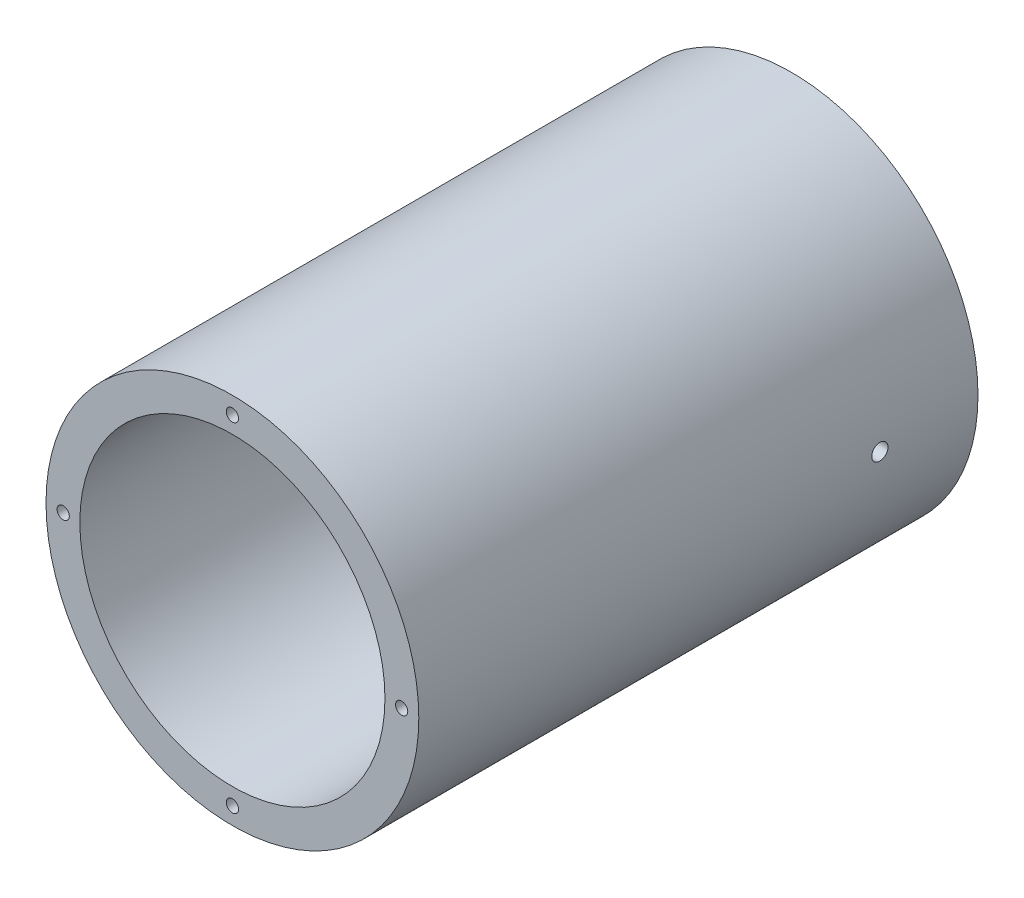
ISO-10303-21;
HEADER;
FILE_DESCRIPTION(('STEP AP214'),'2;1');
FILE_NAME('part.step','',(''),(''),'','','');
FILE_SCHEMA(('AUTOMOTIVE_DESIGN { 1 0 10303 214 1 1 1 1 }'));
ENDSEC;
DATA;
#1=APPLICATION_CONTEXT('core data for automotive mechanical design processes');
#2=APPLICATION_PROTOCOL_DEFINITION('international standard','automotive_design',2000,#1);
#3=PRODUCT_CONTEXT('',#1,'mechanical');
#4=PRODUCT('Part','Part','',(#3));
#5=PRODUCT_RELATED_PRODUCT_CATEGORY('part','',(#4));
#6=PRODUCT_DEFINITION_FORMATION('','',#4);
#7=PRODUCT_DEFINITION_CONTEXT('part definition',#1,'design');
#8=PRODUCT_DEFINITION('design','',#6,#7);
#9=PRODUCT_DEFINITION_SHAPE('','',#8);
#10=(LENGTH_UNIT() NAMED_UNIT(*) SI_UNIT(.MILLI.,.METRE.));
#11=(NAMED_UNIT(*) PLANE_ANGLE_UNIT() SI_UNIT($,.RADIAN.));
#12=(NAMED_UNIT(*) SI_UNIT($,.STERADIAN.) SOLID_ANGLE_UNIT());
#13=UNCERTAINTY_MEASURE_WITH_UNIT(LENGTH_MEASURE(1.E-05),#10,'distance_accuracy_value','');
#14=(GEOMETRIC_REPRESENTATION_CONTEXT(3) GLOBAL_UNCERTAINTY_ASSIGNED_CONTEXT((#13)) GLOBAL_UNIT_ASSIGNED_CONTEXT((#10,
#11,#12)) REPRESENTATION_CONTEXT('',''));
#15=CARTESIAN_POINT('',(0.,0.,0.));
#16=DIRECTION('',(0.,0.,1.));
#17=DIRECTION('',(1.,0.,0.));
#18=AXIS2_PLACEMENT_3D('',#15,#16,#17);
#19=CARTESIAN_POINT('',(0.,0.,57.));
#20=DIRECTION('',(0.,0.,1.));
#21=DIRECTION('',(1.,0.,0.));
#22=AXIS2_PLACEMENT_3D('',#19,#20,#21);
#23=PLANE('',#22);
#24=CARTESIAN_POINT('',(0.,34.5,57.));
#25=DIRECTION('',(0.,0.,1.));
#26=DIRECTION('',(1.,0.,0.));
#27=AXIS2_PLACEMENT_3D('',#24,#25,#26);
#28=CIRCLE('',#27,1.24999999999999);
#29=CARTESIAN_POINT('',(1.24999999999999,34.5,57.));
#30=VERTEX_POINT('',#29);
#31=EDGE_CURVE('E125',#30,#30,#28,.T.);
#32=ORIENTED_EDGE('',*,*,#31,.F.);
#33=EDGE_LOOP('',(#32));
#34=FACE_BOUND('',#33,.T.);
#35=CARTESIAN_POINT('',(34.500000000002,1.95687291924082E-12,57.));
#36=DIRECTION('',(0.,0.,1.));
#37=DIRECTION('',(1.,0.,0.));
#38=AXIS2_PLACEMENT_3D('',#35,#36,#37);
#39=CIRCLE('',#38,1.24999999999999);
#40=CARTESIAN_POINT('',(35.7500000000019,1.95687291924082E-12,57.));
#41=VERTEX_POINT('',#40);
#42=EDGE_CURVE('E131',#41,#41,#39,.T.);
#43=ORIENTED_EDGE('',*,*,#42,.F.);
#44=EDGE_LOOP('',(#43));
#45=FACE_BOUND('',#44,.T.);
#46=CARTESIAN_POINT('',(3.91374583848164E-12,-34.5,57.));
#47=DIRECTION('',(0.,0.,1.));
#48=DIRECTION('',(1.,0.,0.));
#49=AXIS2_PLACEMENT_3D('',#46,#47,#48);
#50=CIRCLE('',#49,1.24999999999999);
#51=CARTESIAN_POINT('',(1.2500000000039,-34.5,57.));
#52=VERTEX_POINT('',#51);
#53=EDGE_CURVE('E137',#52,#52,#50,.T.);
#54=ORIENTED_EDGE('',*,*,#53,.F.);
#55=EDGE_LOOP('',(#54));
#56=FACE_BOUND('',#55,.T.);
#57=CARTESIAN_POINT('',(-34.4999999999981,-1.95264788778376E-12,57.));
#58=DIRECTION('',(0.,0.,1.));
#59=DIRECTION('',(1.,0.,0.));
#60=AXIS2_PLACEMENT_3D('',#57,#58,#59);
#61=CIRCLE('',#60,1.24999999999999);
#62=CARTESIAN_POINT('',(-33.2499999999981,-1.95264788778376E-12,57.));
#63=VERTEX_POINT('',#62);
#64=EDGE_CURVE('E145',#63,#63,#61,.T.);
#65=ORIENTED_EDGE('',*,*,#64,.F.);
#66=EDGE_LOOP('',(#65));
#67=FACE_BOUND('',#66,.T.);
#68=CARTESIAN_POINT('',(0.,0.,57.));
#69=DIRECTION('',(0.,0.,1.));
#70=DIRECTION('',(1.,0.,0.));
#71=AXIS2_PLACEMENT_3D('',#68,#69,#70);
#72=CIRCLE('',#71,38.);
#73=CARTESIAN_POINT('',(38.,0.,57.));
#74=VERTEX_POINT('',#73);
#75=EDGE_CURVE('E11',#74,#74,#72,.T.);
#76=ORIENTED_EDGE('',*,*,#75,.T.);
#77=EDGE_LOOP('',(#76));
#78=FACE_BOUND('',#77,.T.);
#79=CARTESIAN_POINT('',(0.,0.,57.));
#80=DIRECTION('',(0.,0.,1.));
#81=DIRECTION('',(1.,0.,0.));
#82=AXIS2_PLACEMENT_3D('',#79,#80,#81);
#83=CIRCLE('',#82,31.1);
#84=CARTESIAN_POINT('',(31.1,0.,57.));
#85=VERTEX_POINT('',#84);
#86=EDGE_CURVE('E152',#85,#85,#83,.T.);
#87=ORIENTED_EDGE('',*,*,#86,.F.);
#88=EDGE_LOOP('',(#87));
#89=FACE_BOUND('',#88,.T.);
#90=ADVANCED_FACE('F45',(#34,#45,#56,#67,#78,#89),#23,.T.);
#91=CARTESIAN_POINT('',(0.,0.,-57.));
#92=DIRECTION('',(0.,0.,1.));
#93=DIRECTION('',(1.,0.,0.));
#94=AXIS2_PLACEMENT_3D('',#91,#92,#93);
#95=PLANE('',#94);
#96=CARTESIAN_POINT('',(-34.5,-1.14491749414469E-13,-57.));
#97=DIRECTION('',(0.,0.,-1.));
#98=DIRECTION('',(-1.,0.,0.));
#99=AXIS2_PLACEMENT_3D('',#96,#97,#98);
#100=CIRCLE('',#99,1.24999999999999);
#101=CARTESIAN_POINT('',(-35.75,-1.14491749414469E-13,-57.));
#102=VERTEX_POINT('',#101);
#103=EDGE_CURVE('E96',#102,#102,#100,.T.);
#104=ORIENTED_EDGE('',*,*,#103,.F.);
#105=EDGE_LOOP('',(#104));
#106=FACE_BOUND('',#105,.T.);
#107=CARTESIAN_POINT('',(1.14491749414469E-13,-34.5,-57.));
#108=DIRECTION('',(0.,0.,-1.));
#109=DIRECTION('',(-1.,0.,0.));
#110=AXIS2_PLACEMENT_3D('',#107,#108,#109);
#111=CIRCLE('',#110,1.24999999999999);
#112=CARTESIAN_POINT('',(-1.24999999999987,-34.5,-57.));
#113=VERTEX_POINT('',#112);
#114=EDGE_CURVE('E95',#113,#113,#111,.T.);
#115=ORIENTED_EDGE('',*,*,#114,.F.);
#116=EDGE_LOOP('',(#115));
#117=FACE_BOUND('',#116,.T.);
#118=CARTESIAN_POINT('',(34.5,1.17961196366423E-13,-57.));
#119=DIRECTION('',(0.,0.,-1.));
#120=DIRECTION('',(-1.,0.,0.));
#121=AXIS2_PLACEMENT_3D('',#118,#119,#120);
#122=CIRCLE('',#121,1.24999999999999);
#123=CARTESIAN_POINT('',(33.25,1.17961196366423E-13,-57.));
#124=VERTEX_POINT('',#123);
#125=EDGE_CURVE('E111',#124,#124,#122,.T.);
#126=ORIENTED_EDGE('',*,*,#125,.F.);
#127=EDGE_LOOP('',(#126));
#128=FACE_BOUND('',#127,.T.);
#129=CARTESIAN_POINT('',(-1.21430643318376E-13,34.5,-57.));
#130=DIRECTION('',(0.,0.,-1.));
#131=DIRECTION('',(-1.,0.,0.));
#132=AXIS2_PLACEMENT_3D('',#129,#130,#131);
#133=CIRCLE('',#132,1.24999999999999);
#134=CARTESIAN_POINT('',(-1.25000000000011,34.5,-57.));
#135=VERTEX_POINT('',#134);
#136=EDGE_CURVE('E119',#135,#135,#133,.T.);
#137=ORIENTED_EDGE('',*,*,#136,.F.);
#138=EDGE_LOOP('',(#137));
#139=FACE_BOUND('',#138,.T.);
#140=CARTESIAN_POINT('',(0.,0.,-57.));
#141=DIRECTION('',(0.,0.,1.));
#142=DIRECTION('',(1.,0.,0.));
#143=AXIS2_PLACEMENT_3D('',#140,#141,#142);
#144=CIRCLE('',#143,38.);
#145=CARTESIAN_POINT('',(38.,0.,-57.));
#146=VERTEX_POINT('',#145);
#147=EDGE_CURVE('E50',#146,#146,#144,.T.);
#148=ORIENTED_EDGE('',*,*,#147,.F.);
#149=EDGE_LOOP('',(#148));
#150=FACE_BOUND('',#149,.T.);
#151=CARTESIAN_POINT('',(0.,0.,-57.));
#152=DIRECTION('',(0.,0.,1.));
#153=DIRECTION('',(1.,0.,0.));
#154=AXIS2_PLACEMENT_3D('',#151,#152,#153);
#155=CIRCLE('',#154,31.1);
#156=CARTESIAN_POINT('',(31.1,0.,-57.));
#157=VERTEX_POINT('',#156);
#158=EDGE_CURVE('E151',#157,#157,#155,.T.);
#159=ORIENTED_EDGE('',*,*,#158,.T.);
#160=EDGE_LOOP('',(#159));
#161=FACE_BOUND('',#160,.T.);
#162=ADVANCED_FACE('F159',(#106,#117,#128,#139,#150,#161),#95,.F.);
#163=CARTESIAN_POINT('',(0.,0.,57.));
#164=DIRECTION('',(0.,0.,-1.));
#165=DIRECTION('',(-1.,0.,0.));
#166=AXIS2_PLACEMENT_3D('',#163,#164,#165);
#167=CYLINDRICAL_SURFACE('',#166,38.);
#168=CARTESIAN_POINT('',(38.,0.,-38.65));
#169=CARTESIAN_POINT('',(37.9999995194342,-0.0926343873516706,-38.6499959066816));
#170=CARTESIAN_POINT('',(37.9996576411054,-0.185334831172281,-38.642172778328));
#171=CARTESIAN_POINT('',(37.9983266871406,-0.368179488595521,-38.6110751267147));
#172=CARTESIAN_POINT('',(37.9973368449294,-0.458320542349799,-38.5877823015173));
#173=CARTESIAN_POINT('',(37.9948220211121,-0.633371208626469,-38.5264124783285));
#174=CARTESIAN_POINT('',(37.9932973080715,-0.718283421510545,-38.4883428989159));
#175=CARTESIAN_POINT('',(37.9898845637712,-0.88048880307308,-38.3985113360063));
#176=CARTESIAN_POINT('',(37.9879966194285,-0.957783787787719,-38.3467526270507));
#177=CARTESIAN_POINT('',(37.9840681874147,-1.1026455365318,-38.2309655505124));
#178=CARTESIAN_POINT('',(37.9820275950093,-1.17020552646643,-38.1669287107212));
#179=CARTESIAN_POINT('',(37.9780247628371,-1.29362194407478,-38.0284195977331));
#180=CARTESIAN_POINT('',(37.9760625262425,-1.34947789832146,-37.9539469026101));
#181=CARTESIAN_POINT('',(37.9724369874736,-1.44791760866178,-37.7966468191449));
#182=CARTESIAN_POINT('',(37.9707737984872,-1.49049634385826,-37.7138162858469));
#183=CARTESIAN_POINT('',(37.9679351157005,-1.56114066866396,-37.542173978369));
#184=CARTESIAN_POINT('',(37.9667596188709,-1.58920634842029,-37.453362241345));
#185=CARTESIAN_POINT('',(37.9650297812511,-1.63001071322264,-37.2723384638531));
#186=CARTESIAN_POINT('',(37.964475045539,-1.64275914332505,-37.1801286238415));
#187=CARTESIAN_POINT('',(37.9640480975593,-1.6525971836999,-36.9948761701993));
#188=CARTESIAN_POINT('',(37.9641758809286,-1.64968689407335,-36.9018335618961));
#189=CARTESIAN_POINT('',(37.9650991939384,-1.62829825058813,-36.7176228857958));
#190=CARTESIAN_POINT('',(37.9658942721118,-1.60983042235951,-36.6264535932951));
#191=CARTESIAN_POINT('',(37.9680618446454,-1.55786723848223,-36.4485104455133));
#192=CARTESIAN_POINT('',(37.9694343409976,-1.52437183098991,-36.3617366053971));
#193=CARTESIAN_POINT('',(37.9726025679745,-1.44329225223816,-36.1950136275335));
#194=CARTESIAN_POINT('',(37.974398443021,-1.39570327199294,-36.1150668313145));
#195=CARTESIAN_POINT('',(37.9782108525346,-1.28779094357622,-35.9642929642205));
#196=CARTESIAN_POINT('',(37.9802273881547,-1.22746752886342,-35.8934659410022));
#197=CARTESIAN_POINT('',(37.9842558279272,-1.09573924181622,-35.7628808622904));
#198=CARTESIAN_POINT('',(37.9862677268738,-1.02432525129551,-35.7031320042601));
#199=CARTESIAN_POINT('',(37.9900585103676,-0.87247507991611,-35.5964701540293));
#200=CARTESIAN_POINT('',(37.9918373948659,-0.792038897167133,-35.5495571645183));
#201=CARTESIAN_POINT('',(37.9949617056859,-0.624422345518426,-35.469899672236));
#202=CARTESIAN_POINT('',(37.9963071225581,-0.537241829643564,-35.4371554783394));
#203=CARTESIAN_POINT('',(37.9984127129505,-0.358613696426568,-35.3867710218167));
#204=CARTESIAN_POINT('',(37.9991728897805,-0.267166103219724,-35.3691306737718));
#205=CARTESIAN_POINT('',(38.000021895611,-0.0826795501663628,-35.3494659641771));
#206=CARTESIAN_POINT('',(38.0001112716218,0.01035805102182,-35.347428878783));
#207=CARTESIAN_POINT('',(37.9996100533562,0.195453818730521,-35.3589953327662));
#208=CARTESIAN_POINT('',(37.9990194607665,0.287511987680261,-35.3725988333421));
#209=CARTESIAN_POINT('',(37.9972251928853,0.468000116688769,-35.4150497753351));
#210=CARTESIAN_POINT('',(37.9960217507579,0.556431442797455,-35.4438914194162));
#211=CARTESIAN_POINT('',(37.9931373199913,0.727197679025692,-35.5159940633972));
#212=CARTESIAN_POINT('',(37.9914563292868,0.80953256277903,-35.5592551256544));
#213=CARTESIAN_POINT('',(37.9878046416091,0.965827212367055,-35.6590012354753));
#214=CARTESIAN_POINT('',(37.985833757794,1.03978152191713,-35.7154948256876));
#215=CARTESIAN_POINT('',(37.9818249288001,1.17716089568691,-35.8400898419622));
#216=CARTESIAN_POINT('',(37.979786983291,1.24058590802369,-35.908191325219));
#217=CARTESIAN_POINT('',(37.9758721891793,1.35514899571533,-36.0541236369915));
#218=CARTESIAN_POINT('',(37.9739954489289,1.4062788479287,-36.1319609243227));
#219=CARTESIAN_POINT('',(37.9706163826996,1.49474403258342,-36.295122597683));
#220=CARTESIAN_POINT('',(37.9691140553915,1.53207941399412,-36.3804469571324));
#221=CARTESIAN_POINT('',(37.9666539884121,1.5918814681568,-36.5561300753228));
#222=CARTESIAN_POINT('',(37.9656960556686,1.61435341276018,-36.6464870367291));
#223=CARTESIAN_POINT('',(37.9644322501256,1.64380795207979,-36.8296957044246));
#224=CARTESIAN_POINT('',(37.9641263748285,1.65079060612304,-36.922547401157));
#225=CARTESIAN_POINT('',(37.9642012430132,1.64906774813583,-37.1080278761415));
#226=CARTESIAN_POINT('',(37.9645814200104,1.64037517939304,-37.2006567751278));
#227=CARTESIAN_POINT('',(37.9659843452615,1.60757534012015,-37.3831389278321));
#228=CARTESIAN_POINT('',(37.9670070947612,1.58346803969957,-37.4729921761677));
#229=CARTESIAN_POINT('',(37.969579765854,1.52052551056582,-37.6473756383981));
#230=CARTESIAN_POINT('',(37.9711296936865,1.48169010753575,-37.7319057892769));
#231=CARTESIAN_POINT('',(37.9745819629553,1.39039641296064,-37.8932462093979));
#232=CARTESIAN_POINT('',(37.9764842928381,1.33793856800806,-37.9700567316028));
#233=CARTESIAN_POINT('',(37.9804286955674,1.22084420114374,-38.1138412374282));
#234=CARTESIAN_POINT('',(37.9824708677174,1.15619896651988,-38.1808081225429));
#235=CARTESIAN_POINT('',(37.9864642159771,1.01656476762932,-38.3029587254949));
#236=CARTESIAN_POINT('',(37.9884153695212,0.94157325634956,-38.3581395333238));
#237=CARTESIAN_POINT('',(37.9920078745747,0.783327797499344,-38.4551710373054));
#238=CARTESIAN_POINT('',(37.993648965049,0.700066977350689,-38.4970105218983));
#239=CARTESIAN_POINT('',(37.9964322609654,0.527758473785391,-38.5660671290563));
#240=CARTESIAN_POINT('',(37.9975750575366,0.438717791979388,-38.5933015865233));
#241=CARTESIAN_POINT('',(37.9989295116819,0.290933584448799,-38.6252030188477));
#242=CARTESIAN_POINT('',(37.9993291892242,0.23314808194173,-38.6344900810134));
#243=CARTESIAN_POINT('',(37.9998645849686,0.116917158880258,-38.646889861506));
#244=CARTESIAN_POINT('',(38.0000003033378,0.058471738743788,-38.650002583743));
#245=CARTESIAN_POINT('',(38.,0.,-38.65));
#246=B_SPLINE_CURVE_WITH_KNOTS('',3,(#168,#169,#170,#171,#172,#173,#174,#175,#176,#177,#178,
#179,#180,#181,#182,#183,#184,#185,#186,#187,#188,#189,#190,#191,#192,#193,#194,#195,#196,#197,
#198,#199,#200,#201,#202,#203,#204,#205,#206,#207,#208,#209,#210,#211,#212,#213,#214,#215,#216,
#217,#218,#219,#220,#221,#222,#223,#224,#225,#226,#227,#228,#229,#230,#231,#232,#233,#234,#235,
#236,#237,#238,#239,#240,#241,#242,#243,#244,#245),.UNSPECIFIED.,.T.,.F.,(4,2,2,2,2,2,2,2,2,2,2,
2,2,2,2,2,2,2,2,2,2,2,2,2,2,2,2,2,2,2,2,2,2,2,2,2,2,2,4),(0.,0.277689723908341,0.55570856448434,
0.833588007566176,1.11140103984864,1.38940646428512,1.66742313184257,1.94554480670585,
2.22366475400959,2.50160766351495,2.77954879622557,3.05730203557773,3.33505623315867,
3.61290531498349,3.89075584869049,4.16883604025131,4.44691629007441,4.72500260163852,
5.00308734049132,5.28094528805699,5.55880254630918,5.83655417009631,6.11430699504812,
6.39223962815774,6.67017363073479,6.94829300489981,7.22641139175251,7.50443108096261,
7.78244970530096,8.06023887022386,8.3380285738055,8.61582156531613,8.89360545092686,
9.1715886812928,9.44964046718964,9.7279253055539,10.0058791087496,10.1811597117191,
10.3564402036877),.UNSPECIFIED.);
#247=CARTESIAN_POINT('',(38.,0.,-38.65));
#248=VERTEX_POINT('',#247);
#249=EDGE_CURVE('E203',#248,#248,#246,.T.);
#250=ORIENTED_EDGE('',*,*,#249,.T.);
#251=EDGE_LOOP('',(#250));
#252=FACE_BOUND('',#251,.T.);
#253=CARTESIAN_POINT('',(-38.,0.,-35.35));
#254=CARTESIAN_POINT('',(-37.9999995194343,-0.0926343873516702,-35.3500040933184));
#255=CARTESIAN_POINT('',(-37.9996576411054,-0.18533483117228,-35.357827221672));
#256=CARTESIAN_POINT('',(-37.9983266871406,-0.368179488595519,-35.3889248732853));
#257=CARTESIAN_POINT('',(-37.9973368449294,-0.458320542349798,-35.4122176984827));
#258=CARTESIAN_POINT('',(-37.9948220211121,-0.633371208626468,-35.4735875216715));
#259=CARTESIAN_POINT('',(-37.9932973080715,-0.718283421510543,-35.5116571010841));
#260=CARTESIAN_POINT('',(-37.9898845637712,-0.880488803073077,-35.6014886639937));
#261=CARTESIAN_POINT('',(-37.9879966194285,-0.957783787787716,-35.6532473729493));
#262=CARTESIAN_POINT('',(-37.9840681874147,-1.10264553653179,-35.7690344494876));
#263=CARTESIAN_POINT('',(-37.9820275950093,-1.17020552646642,-35.8330712892788));
#264=CARTESIAN_POINT('',(-37.9780247628371,-1.29362194407478,-35.9715804022669));
#265=CARTESIAN_POINT('',(-37.9760625262425,-1.34947789832146,-36.0460530973899));
#266=CARTESIAN_POINT('',(-37.9724369874736,-1.44791760866178,-36.2033531808551));
#267=CARTESIAN_POINT('',(-37.9707737984872,-1.49049634385826,-36.2861837141531));
#268=CARTESIAN_POINT('',(-37.9679351157005,-1.56114066866396,-36.457826021631));
#269=CARTESIAN_POINT('',(-37.9667596188709,-1.58920634842029,-36.546637758655));
#270=CARTESIAN_POINT('',(-37.9650297812511,-1.63001071322264,-36.7276615361469));
#271=CARTESIAN_POINT('',(-37.964475045539,-1.64275914332505,-36.8198713761585));
#272=CARTESIAN_POINT('',(-37.9640480975593,-1.65259718369991,-37.0051238298007));
#273=CARTESIAN_POINT('',(-37.9641758809286,-1.64968689407335,-37.0981664381039));
#274=CARTESIAN_POINT('',(-37.9650991939384,-1.62829825058814,-37.2823771142042));
#275=CARTESIAN_POINT('',(-37.9658942721118,-1.60983042235951,-37.3735464067049));
#276=CARTESIAN_POINT('',(-37.9680618446454,-1.55786723848224,-37.5514895544868));
#277=CARTESIAN_POINT('',(-37.9694343409976,-1.52437183098992,-37.6382633946029));
#278=CARTESIAN_POINT('',(-37.9726025679745,-1.44329225223817,-37.8049863724665));
#279=CARTESIAN_POINT('',(-37.974398443021,-1.39570327199295,-37.8849331686855));
#280=CARTESIAN_POINT('',(-37.9782108525346,-1.28779094357623,-38.0357070357795));
#281=CARTESIAN_POINT('',(-37.9802273881547,-1.22746752886342,-38.1065340589978));
#282=CARTESIAN_POINT('',(-37.9842558279272,-1.09573924181623,-38.2371191377096));
#283=CARTESIAN_POINT('',(-37.9862677268738,-1.02432525129551,-38.2968679957399));
#284=CARTESIAN_POINT('',(-37.9900585103676,-0.872475079916113,-38.4035298459707));
#285=CARTESIAN_POINT('',(-37.9918373948659,-0.792038897167137,-38.4504428354817));
#286=CARTESIAN_POINT('',(-37.9949617056859,-0.62442234551843,-38.530100327764));
#287=CARTESIAN_POINT('',(-37.9963071225581,-0.537241829643569,-38.5628445216606));
#288=CARTESIAN_POINT('',(-37.9984127129505,-0.358613696426574,-38.6132289781833));
#289=CARTESIAN_POINT('',(-37.9991728897805,-0.267166103219732,-38.6308693262282));
#290=CARTESIAN_POINT('',(-38.000021895611,-0.0826795501663728,-38.6505340358229));
#291=CARTESIAN_POINT('',(-38.0001112716218,0.0103580510218101,-38.652571121217));
#292=CARTESIAN_POINT('',(-37.9996100533562,0.195453818730512,-38.6410046672338));
#293=CARTESIAN_POINT('',(-37.9990194607665,0.287511987680253,-38.6274011666579));
#294=CARTESIAN_POINT('',(-37.9972251928853,0.46800011668876,-38.584950224665));
#295=CARTESIAN_POINT('',(-37.9960217507579,0.556431442797445,-38.5561085805838));
#296=CARTESIAN_POINT('',(-37.9931373199913,0.727197679025683,-38.4840059366028));
#297=CARTESIAN_POINT('',(-37.9914563292868,0.809532562779022,-38.4407448743456));
#298=CARTESIAN_POINT('',(-37.9878046416091,0.96582721236705,-38.3409987645247));
#299=CARTESIAN_POINT('',(-37.985833757794,1.03978152191712,-38.2845051743125));
#300=CARTESIAN_POINT('',(-37.9818249288001,1.1771608956869,-38.1599101580378));
#301=CARTESIAN_POINT('',(-37.979786983291,1.24058590802369,-38.0918086747811));
#302=CARTESIAN_POINT('',(-37.9758721891793,1.35514899571533,-37.9458763630085));
#303=CARTESIAN_POINT('',(-37.9739954489289,1.40627884792869,-37.8680390756773));
#304=CARTESIAN_POINT('',(-37.9706163826996,1.49474403258341,-37.704877402317));
#305=CARTESIAN_POINT('',(-37.9691140553915,1.53207941399411,-37.6195530428676));
#306=CARTESIAN_POINT('',(-37.9666539884121,1.5918814681568,-37.4438699246772));
#307=CARTESIAN_POINT('',(-37.9656960556686,1.61435341276017,-37.3535129632709));
#308=CARTESIAN_POINT('',(-37.9644322501256,1.64380795207978,-37.1703042955755));
#309=CARTESIAN_POINT('',(-37.9641263748285,1.65079060612303,-37.077452598843));
#310=CARTESIAN_POINT('',(-37.9642012430132,1.64906774813583,-36.8919721238585));
#311=CARTESIAN_POINT('',(-37.9645814200104,1.64037517939304,-36.7993432248723));
#312=CARTESIAN_POINT('',(-37.9659843452615,1.60757534012015,-36.6168610721679));
#313=CARTESIAN_POINT('',(-37.9670070947612,1.58346803969956,-36.5270078238323));
#314=CARTESIAN_POINT('',(-37.969579765854,1.52052551056582,-36.3526243616019));
#315=CARTESIAN_POINT('',(-37.9711296936865,1.48169010753574,-36.2680942107232));
#316=CARTESIAN_POINT('',(-37.9745819629553,1.39039641296064,-36.1067537906021));
#317=CARTESIAN_POINT('',(-37.9764842928381,1.33793856800806,-36.0299432683972));
#318=CARTESIAN_POINT('',(-37.9804286955674,1.22084420114374,-35.8861587625718));
#319=CARTESIAN_POINT('',(-37.9824708677174,1.15619896651987,-35.8191918774571));
#320=CARTESIAN_POINT('',(-37.9864642159771,1.01656476762932,-35.6970412745051));
#321=CARTESIAN_POINT('',(-37.9884153695212,0.941573256349557,-35.6418604666762));
#322=CARTESIAN_POINT('',(-37.9920078745747,0.783327797499342,-35.5448289626946));
#323=CARTESIAN_POINT('',(-37.993648965049,0.700066977350689,-35.5029894781017));
#324=CARTESIAN_POINT('',(-37.9964322609654,0.527758473785391,-35.4339328709437));
#325=CARTESIAN_POINT('',(-37.9975750575366,0.438717791979388,-35.4066984134767));
#326=CARTESIAN_POINT('',(-37.9989295116819,0.290933584448799,-35.3747969811523));
#327=CARTESIAN_POINT('',(-37.9993291892242,0.233148081941729,-35.3655099189866));
#328=CARTESIAN_POINT('',(-37.9998645849686,0.116917158880257,-35.353110138494));
#329=CARTESIAN_POINT('',(-38.0000003033378,0.0584717387437875,-35.3499974162571));
#330=CARTESIAN_POINT('',(-38.,0.,-35.35));
#331=B_SPLINE_CURVE_WITH_KNOTS('',3,(#253,#254,#255,#256,#257,#258,#259,#260,#261,#262,#263,
#264,#265,#266,#267,#268,#269,#270,#271,#272,#273,#274,#275,#276,#277,#278,#279,#280,#281,#282,
#283,#284,#285,#286,#287,#288,#289,#290,#291,#292,#293,#294,#295,#296,#297,#298,#299,#300,#301,
#302,#303,#304,#305,#306,#307,#308,#309,#310,#311,#312,#313,#314,#315,#316,#317,#318,#319,#320,
#321,#322,#323,#324,#325,#326,#327,#328,#329,#330),.UNSPECIFIED.,.T.,.F.,(4,2,2,2,2,2,2,2,2,2,2,
2,2,2,2,2,2,2,2,2,2,2,2,2,2,2,2,2,2,2,2,2,2,2,2,2,2,2,4),(0.,0.27768972390834,0.555708564484338,
0.833588007566171,1.11140103984864,1.38940646428512,1.66742313184256,1.94554480670585,
2.22366475400959,2.50160766351495,2.77954879622557,3.05730203557773,3.33505623315867,
3.61290531498349,3.89075584869049,4.16883604025131,4.44691629007441,4.72500260163852,
5.00308734049131,5.28094528805699,5.55880254630918,5.83655417009631,6.11430699504812,
6.39223962815775,6.6701736307348,6.94829300489981,7.2264113917525,7.50443108096261,
7.78244970530096,8.06023887022386,8.3380285738055,8.61582156531614,8.89360545092686,
9.17158868129281,9.44964046718964,9.7279253055539,10.0058791087496,10.1811597117191,
10.3564402036877),.UNSPECIFIED.);
#332=CARTESIAN_POINT('',(-38.,0.,-35.35));
#333=VERTEX_POINT('',#332);
#334=EDGE_CURVE('E104',#333,#333,#331,.T.);
#335=ORIENTED_EDGE('',*,*,#334,.T.);
#336=EDGE_LOOP('',(#335));
#337=FACE_BOUND('',#336,.T.);
#338=ORIENTED_EDGE('',*,*,#75,.F.);
#339=EDGE_LOOP('',(#338));
#340=FACE_BOUND('',#339,.T.);
#341=ORIENTED_EDGE('',*,*,#147,.T.);
#342=EDGE_LOOP('',(#341));
#343=FACE_BOUND('',#342,.T.);
#344=ADVANCED_FACE('F47',(#252,#337,#340,#343),#167,.T.);
#345=CARTESIAN_POINT('',(0.,0.,57.));
#346=DIRECTION('',(0.,0.,-1.));
#347=DIRECTION('',(-1.,0.,0.));
#348=AXIS2_PLACEMENT_3D('',#345,#346,#347);
#349=CYLINDRICAL_SURFACE('',#348,31.1);
#350=CARTESIAN_POINT('',(31.1,0.,-38.65));
#351=CARTESIAN_POINT('',(31.0999994152321,-0.0926113241606523,-38.6499959154635));
#352=CARTESIAN_POINT('',(31.0995818961851,-0.185288139437185,-38.6421766664444));
#353=CARTESIAN_POINT('',(31.0979564687568,-0.368084609602513,-38.6110953224945));
#354=CARTESIAN_POINT('',(31.0967476316719,-0.458201129862964,-38.5878150818264));
#355=CARTESIAN_POINT('',(31.0936763729875,-0.633202609159297,-38.5264806466731));
#356=CARTESIAN_POINT('',(31.0918142871412,-0.718090229418302,-38.4884340406587));
#357=CARTESIAN_POINT('',(31.0876461833369,-0.880251284767709,-38.3986586845234));
#358=CARTESIAN_POINT('',(31.0853402695076,-0.957526499428521,-38.3469331426279));
#359=CARTESIAN_POINT('',(31.0805409788606,-1.10237850746259,-38.2312040472641));
#360=CARTESIAN_POINT('',(31.0780474202581,-1.16994570678198,-38.1671884920017));
#361=CARTESIAN_POINT('',(31.0731554426785,-1.29338186000706,-38.028720727143));
#362=CARTESIAN_POINT('',(31.0707570276108,-1.34925033362335,-37.9542680892633));
#363=CARTESIAN_POINT('',(31.0663244795823,-1.4477304993483,-37.796988094922));
#364=CARTESIAN_POINT('',(31.0642905566219,-1.49033455958087,-37.7141559533659));
#365=CARTESIAN_POINT('',(31.0608186100049,-1.56102760258269,-37.5425018979678));
#366=CARTESIAN_POINT('',(31.0593805814049,-1.58911670576286,-37.4536800338214));
#367=CARTESIAN_POINT('',(31.0572642570339,-1.62995676452337,-37.27265735383));
#368=CARTESIAN_POINT('',(31.0565852403766,-1.64272227483483,-37.1804598302031));
#369=CARTESIAN_POINT('',(31.0560613488158,-1.65259769452295,-36.9952282443879));
#370=CARTESIAN_POINT('',(31.0562164666889,-1.6497077394726,-36.9021941894508));
#371=CARTESIAN_POINT('',(31.0573426818807,-1.62836637537512,-36.7180294209294));
#372=CARTESIAN_POINT('',(31.0583129543335,-1.60993069718465,-36.6268968786799));
#373=CARTESIAN_POINT('',(31.0609588238351,-1.55804559095354,-36.4490218273883));
#374=CARTESIAN_POINT('',(31.0626344241439,-1.52459609351887,-36.3622793386392));
#375=CARTESIAN_POINT('',(31.0665030509316,-1.44361491569553,-36.1955960457115));
#376=CARTESIAN_POINT('',(31.0686963405178,-1.39607607146902,-36.1156587283555));
#377=CARTESIAN_POINT('',(31.0733528816609,-1.28827086521181,-35.9648930375069));
#378=CARTESIAN_POINT('',(31.0758161353761,-1.22800440142612,-35.8940647368465));
#379=CARTESIAN_POINT('',(31.0807386466621,-1.09636596673258,-35.7634360839669));
#380=CARTESIAN_POINT('',(31.0831978955434,-1.02498037535889,-35.7036494563119));
#381=CARTESIAN_POINT('',(31.0878322966669,-0.873177901355367,-35.596907053533));
#382=CARTESIAN_POINT('',(31.0900074488334,-0.792761016316848,-35.549951281831));
#383=CARTESIAN_POINT('',(31.0938286336405,-0.625170599617447,-35.4702047738429));
#384=CARTESIAN_POINT('',(31.0954746480488,-0.537996835266357,-35.4374145256382));
#385=CARTESIAN_POINT('',(31.0980517942589,-0.359370799027306,-35.3869388742306));
#386=CARTESIAN_POINT('',(31.098982932083,-0.267918563189554,-35.3692533437802));
#387=CARTESIAN_POINT('',(31.1000246134736,-0.0834507088759553,-35.3495060909341));
#388=CARTESIAN_POINT('',(31.1001361539978,0.00956287222664174,-35.3474253867721));
#389=CARTESIAN_POINT('',(31.099528718418,0.194617830106965,-35.3588973004368));
#390=CARTESIAN_POINT('',(31.098809745413,0.286659210510889,-35.3724498599323));
#391=CARTESIAN_POINT('',(31.0966228949766,0.467103797285413,-35.4147878813989));
#392=CARTESIAN_POINT('',(31.0951554441266,0.555509045023619,-35.4435646669467));
#393=CARTESIAN_POINT('',(31.0916368254174,0.726234777514723,-35.5155254735891));
#394=CARTESIAN_POINT('',(31.0895856537723,0.808555222799356,-35.5587095881248));
#395=CARTESIAN_POINT('',(31.0851277955825,0.964861680890577,-35.6583077504693));
#396=CARTESIAN_POINT('',(31.082720768222,1.03883958267008,-35.7147345120106));
#397=CARTESIAN_POINT('',(31.0778233721238,1.17627941681326,-35.8391976602035));
#398=CARTESIAN_POINT('',(31.0753330027877,1.23974127366225,-35.9072341302162));
#399=CARTESIAN_POINT('',(31.070546756719,1.35441156307946,-36.0530671008604));
#400=CARTESIAN_POINT('',(31.0682510765157,1.405607706919,-36.1308732715972));
#401=CARTESIAN_POINT('',(31.0641161837001,1.49420929620524,-36.2939882111947));
#402=CARTESIAN_POINT('',(31.0622769689146,1.53161480730669,-36.3792969443347));
#403=CARTESIAN_POINT('',(31.0592638161962,1.5915519313239,-36.5549500236956));
#404=CARTESIAN_POINT('',(31.0580895289093,1.61409135593567,-36.6452916981427));
#405=CARTESIAN_POINT('',(31.0565376738502,1.6436820364544,-36.8284835173426));
#406=CARTESIAN_POINT('',(31.0561601007993,1.65073339498112,-36.921333645471));
#407=CARTESIAN_POINT('',(31.0562443818244,1.6491468131059,-37.1067844112707));
#408=CARTESIAN_POINT('',(31.0567052017506,1.64052820147472,-37.1993852153976));
#409=CARTESIAN_POINT('',(31.0584121462566,1.60788631255557,-37.3818231336803));
#410=CARTESIAN_POINT('',(31.0596582723183,1.58386300619954,-37.4716602426209));
#411=CARTESIAN_POINT('',(31.0627951475925,1.52109771673223,-37.6460243770518));
#412=CARTESIAN_POINT('',(31.0646858997703,1.48235566591251,-37.7305513781128));
#413=CARTESIAN_POINT('',(31.0688988783029,1.39125576237728,-37.8919027380986));
#414=CARTESIAN_POINT('',(31.0712210918814,1.33889831281827,-37.9687273250012));
#415=CARTESIAN_POINT('',(31.0760385593577,1.22198392269476,-38.1125900913404));
#416=CARTESIAN_POINT('',(31.0785340045821,1.15741335311111,-38.1796171878606));
#417=CARTESIAN_POINT('',(31.0834152525941,1.01791755120952,-38.3019015923548));
#418=CARTESIAN_POINT('',(31.0858010282914,0.942989778595736,-38.3571560043846));
#419=CARTESIAN_POINT('',(31.0901959323566,0.784841795238977,-38.4543557009085));
#420=CARTESIAN_POINT('',(31.0922046740269,0.701613203414054,-38.4962873513691));
#421=CARTESIAN_POINT('',(31.0956135347009,0.529348417645265,-38.5655313110341));
#422=CARTESIAN_POINT('',(31.0970143708549,0.440319210183044,-38.592860855295));
#423=CARTESIAN_POINT('',(31.0986798226022,0.292282279499183,-38.6249708435447));
#424=CARTESIAN_POINT('',(31.0991727079572,0.23423299117966,-38.6343447599228));
#425=CARTESIAN_POINT('',(31.0998329819642,0.117464585259027,-38.6468606305895));
#426=CARTESIAN_POINT('',(31.1000003709316,0.0587454683067624,-38.6500025909144));
#427=CARTESIAN_POINT('',(31.1,0.,-38.65));
#428=B_SPLINE_CURVE_WITH_KNOTS('',3,(#350,#351,#352,#353,#354,#355,#356,#357,#358,#359,#360,
#361,#362,#363,#364,#365,#366,#367,#368,#369,#370,#371,#372,#373,#374,#375,#376,#377,#378,#379,
#380,#381,#382,#383,#384,#385,#386,#387,#388,#389,#390,#391,#392,#393,#394,#395,#396,#397,#398,
#399,#400,#401,#402,#403,#404,#405,#406,#407,#408,#409,#410,#411,#412,#413,#414,#415,#416,#417,
#418,#419,#420,#421,#422,#423,#424,#425,#426,#427),.UNSPECIFIED.,.T.,.F.,(4,2,2,2,2,2,2,2,2,2,2,
2,2,2,2,2,2,2,2,2,2,2,2,2,2,2,2,2,2,2,2,2,2,2,2,2,2,2,4),(0.,0.277619526729818,
0.555565457785033,0.83336874048357,1.11110692555262,1.38911772787544,1.66713994165224,
1.94532182525421,2.22350140112117,2.50141654548089,2.77932928315863,3.05696113545038,
3.3345942709728,3.61236881411089,3.8901455780896,4.16826532245622,4.44638514099859,
4.72451454155855,5.00264159903458,5.28043028681248,5.55821793810409,5.8358474459889,
6.11347875452281,6.39137770402216,6.66927864900022,6.94745686286721,7.22563375235999,
7.50366435128531,7.78169310804896,8.05937915141552,8.33706571876631,8.61475356353264,
8.89243318680546,9.17042452984501,9.44848417679101,9.72682747019495,10.0048415015226,
10.1809420491967,10.3570424263011),.UNSPECIFIED.);
#429=CARTESIAN_POINT('',(31.1,0.,-38.65));
#430=VERTEX_POINT('',#429);
#431=EDGE_CURVE('E201',#430,#430,#428,.T.);
#432=ORIENTED_EDGE('',*,*,#431,.F.);
#433=EDGE_LOOP('',(#432));
#434=FACE_BOUND('',#433,.T.);
#435=CARTESIAN_POINT('',(-31.1,0.,-35.35));
#436=CARTESIAN_POINT('',(-31.0999994152321,-0.0926113241606824,-35.3500040845365));
#437=CARTESIAN_POINT('',(-31.0995818961851,-0.185288139437215,-35.3578233335556));
#438=CARTESIAN_POINT('',(-31.0979564687568,-0.368084609602542,-35.3889046775055));
#439=CARTESIAN_POINT('',(-31.0967476316719,-0.458201129862992,-35.4121849181736));
#440=CARTESIAN_POINT('',(-31.0936763729875,-0.633202609159325,-35.4735193533269));
#441=CARTESIAN_POINT('',(-31.0918142871412,-0.718090229418329,-35.5115659593413));
#442=CARTESIAN_POINT('',(-31.0876461833369,-0.880251284767735,-35.6013413154766));
#443=CARTESIAN_POINT('',(-31.0853402695076,-0.957526499428546,-35.6530668573721));
#444=CARTESIAN_POINT('',(-31.0805409788606,-1.10237850746262,-35.7687959527359));
#445=CARTESIAN_POINT('',(-31.0780474202581,-1.16994570678201,-35.8328115079983));
#446=CARTESIAN_POINT('',(-31.0731554426785,-1.29338186000708,-35.971279272857));
#447=CARTESIAN_POINT('',(-31.0707570276108,-1.34925033362337,-36.0457319107367));
#448=CARTESIAN_POINT('',(-31.0663244795823,-1.44773049934832,-36.203011905078));
#449=CARTESIAN_POINT('',(-31.0642905566219,-1.49033455958088,-36.2858440466342));
#450=CARTESIAN_POINT('',(-31.0608186100049,-1.5610276025827,-36.4574981020322));
#451=CARTESIAN_POINT('',(-31.0593805814049,-1.58911670576287,-36.5463199661786));
#452=CARTESIAN_POINT('',(-31.0572642570339,-1.62995676452338,-36.72734264617));
#453=CARTESIAN_POINT('',(-31.0565852403766,-1.64272227483483,-36.8195401697969));
#454=CARTESIAN_POINT('',(-31.0560613488158,-1.65259769452295,-37.0047717556121));
#455=CARTESIAN_POINT('',(-31.0562164666889,-1.6497077394726,-37.0978058105492));
#456=CARTESIAN_POINT('',(-31.0573426818807,-1.62836637537512,-37.2819705790706));
#457=CARTESIAN_POINT('',(-31.0583129543335,-1.60993069718465,-37.3731031213202));
#458=CARTESIAN_POINT('',(-31.0609588238351,-1.55804559095354,-37.5509781726117));
#459=CARTESIAN_POINT('',(-31.0626344241439,-1.52459609351886,-37.6377206613608));
#460=CARTESIAN_POINT('',(-31.0665030509316,-1.44361491569552,-37.8044039542885));
#461=CARTESIAN_POINT('',(-31.0686963405178,-1.39607607146901,-37.8843412716446));
#462=CARTESIAN_POINT('',(-31.0733528816609,-1.28827086521179,-38.0351069624932));
#463=CARTESIAN_POINT('',(-31.0758161353761,-1.2280044014261,-38.1059352631535));
#464=CARTESIAN_POINT('',(-31.0807386466621,-1.09636596673256,-38.2365639160332));
#465=CARTESIAN_POINT('',(-31.0831978955434,-1.02498037535887,-38.2963505436881));
#466=CARTESIAN_POINT('',(-31.0878322966669,-0.873177901355345,-38.4030929464671));
#467=CARTESIAN_POINT('',(-31.0900074488334,-0.792761016316826,-38.450048718169));
#468=CARTESIAN_POINT('',(-31.0938286336405,-0.625170599617424,-38.5297952261571));
#469=CARTESIAN_POINT('',(-31.0954746480488,-0.537996835266332,-38.5625854743618));
#470=CARTESIAN_POINT('',(-31.0980517942589,-0.35937079902728,-38.6130611257694));
#471=CARTESIAN_POINT('',(-31.098982932083,-0.267918563189529,-38.6307466562198));
#472=CARTESIAN_POINT('',(-31.1000246134736,-0.0834507088759315,-38.6504939090659));
#473=CARTESIAN_POINT('',(-31.1001361539978,0.00956287222666602,-38.6525746132279));
#474=CARTESIAN_POINT('',(-31.099528718418,0.194617830106989,-38.6411026995632));
#475=CARTESIAN_POINT('',(-31.098809745413,0.286659210510913,-38.6275501400677));
#476=CARTESIAN_POINT('',(-31.0966228949766,0.467103797285436,-38.5852121186011));
#477=CARTESIAN_POINT('',(-31.0951554441266,0.555509045023642,-38.5564353330533));
#478=CARTESIAN_POINT('',(-31.0916368254174,0.726234777514746,-38.4844745264109));
#479=CARTESIAN_POINT('',(-31.0895856537723,0.808555222799376,-38.4412904118752));
#480=CARTESIAN_POINT('',(-31.0851277955825,0.964861680890597,-38.3416922495307));
#481=CARTESIAN_POINT('',(-31.082720768222,1.0388395826701,-38.2852654879894));
#482=CARTESIAN_POINT('',(-31.0778233721238,1.17627941681328,-38.1608023397965));
#483=CARTESIAN_POINT('',(-31.0753330027877,1.23974127366226,-38.0927658697838));
#484=CARTESIAN_POINT('',(-31.070546756719,1.35441156307947,-37.9469328991395));
#485=CARTESIAN_POINT('',(-31.0682510765157,1.40560770691902,-37.8691267284028));
#486=CARTESIAN_POINT('',(-31.0641161837001,1.49420929620525,-37.7060117888053));
#487=CARTESIAN_POINT('',(-31.0622769689146,1.53161480730669,-37.6207030556653));
#488=CARTESIAN_POINT('',(-31.0592638161962,1.59155193132391,-37.4450499763044));
#489=CARTESIAN_POINT('',(-31.0580895289093,1.61409135593567,-37.3547083018573));
#490=CARTESIAN_POINT('',(-31.0565376738502,1.6436820364544,-37.1715164826574));
#491=CARTESIAN_POINT('',(-31.0561601007993,1.65073339498112,-37.0786663545289));
#492=CARTESIAN_POINT('',(-31.0562443818244,1.64914681310589,-36.8932155887293));
#493=CARTESIAN_POINT('',(-31.0567052017506,1.64052820147472,-36.8006147846024));
#494=CARTESIAN_POINT('',(-31.0584121462566,1.60788631255556,-36.6181768663197));
#495=CARTESIAN_POINT('',(-31.0596582723183,1.58386300619953,-36.5283397573791));
#496=CARTESIAN_POINT('',(-31.0627951475925,1.52109771673221,-36.3539756229482));
#497=CARTESIAN_POINT('',(-31.0646858997703,1.48235566591249,-36.2694486218872));
#498=CARTESIAN_POINT('',(-31.0688988783029,1.39125576237726,-36.1080972619014));
#499=CARTESIAN_POINT('',(-31.0712210918814,1.33889831281825,-36.0312726749988));
#500=CARTESIAN_POINT('',(-31.0760385593577,1.22198392269473,-35.8874099086596));
#501=CARTESIAN_POINT('',(-31.0785340045821,1.15741335311109,-35.8203828121394));
#502=CARTESIAN_POINT('',(-31.0834152525941,1.0179175512095,-35.6980984076452));
#503=CARTESIAN_POINT('',(-31.0858010282914,0.942989778595709,-35.6428439956154));
#504=CARTESIAN_POINT('',(-31.0901959323566,0.784841795238949,-35.5456442990915));
#505=CARTESIAN_POINT('',(-31.0922046740269,0.701613203414028,-35.5037126486308));
#506=CARTESIAN_POINT('',(-31.0956135347009,0.52934841764524,-35.4344686889659));
#507=CARTESIAN_POINT('',(-31.0970143708549,0.440319210183017,-35.407139144705));
#508=CARTESIAN_POINT('',(-31.0986798226022,0.292282279499155,-35.3750291564553));
#509=CARTESIAN_POINT('',(-31.0991727079572,0.234232991179632,-35.3656552400772));
#510=CARTESIAN_POINT('',(-31.0998329819642,0.117464585258997,-35.3531393694105));
#511=CARTESIAN_POINT('',(-31.1000003709316,0.0587454683067323,-35.3499974090856));
#512=CARTESIAN_POINT('',(-31.1,0.,-35.35));
#513=B_SPLINE_CURVE_WITH_KNOTS('',3,(#435,#436,#437,#438,#439,#440,#441,#442,#443,#444,#445,
#446,#447,#448,#449,#450,#451,#452,#453,#454,#455,#456,#457,#458,#459,#460,#461,#462,#463,#464,
#465,#466,#467,#468,#469,#470,#471,#472,#473,#474,#475,#476,#477,#478,#479,#480,#481,#482,#483,
#484,#485,#486,#487,#488,#489,#490,#491,#492,#493,#494,#495,#496,#497,#498,#499,#500,#501,#502,
#503,#504,#505,#506,#507,#508,#509,#510,#511,#512),.UNSPECIFIED.,.T.,.F.,(4,2,2,2,2,2,2,2,2,2,2,
2,2,2,2,2,2,2,2,2,2,2,2,2,2,2,2,2,2,2,2,2,2,2,2,2,2,2,4),(0.,0.277619526729818,
0.555565457785033,0.833368740483573,1.11110692555262,1.38911772787544,1.66713994165224,
1.94532182525421,2.22350140112117,2.50141654548088,2.77932928315863,3.05696113545038,
3.3345942709728,3.61236881411089,3.8901455780896,4.16826532245622,4.44638514099859,
4.72451454155855,5.00264159903457,5.28043028681248,5.55821793810409,5.8358474459889,
6.11347875452281,6.39137770402215,6.66927864900021,6.94745686286721,7.22563375235999,
7.5036643512853,7.78169310804895,8.05937915141551,8.33706571876631,8.61475356353264,
8.89243318680546,9.170424529845,9.44848417679101,9.72682747019494,10.0048415015226,
10.1809420491967,10.3570424263011),.UNSPECIFIED.);
#514=CARTESIAN_POINT('',(-31.1,0.,-35.35));
#515=VERTEX_POINT('',#514);
#516=EDGE_CURVE('E207',#515,#515,#513,.T.);
#517=ORIENTED_EDGE('',*,*,#516,.F.);
#518=EDGE_LOOP('',(#517));
#519=FACE_BOUND('',#518,.T.);
#520=ORIENTED_EDGE('',*,*,#86,.T.);
#521=EDGE_LOOP('',(#520));
#522=FACE_BOUND('',#521,.T.);
#523=ORIENTED_EDGE('',*,*,#158,.F.);
#524=EDGE_LOOP('',(#523));
#525=FACE_BOUND('',#524,.T.);
#526=ADVANCED_FACE('F161',(#434,#519,#522,#525),#349,.F.);
#527=CARTESIAN_POINT('',(-34.4999999999981,-1.95264788778376E-12,48.5));
#528=DIRECTION('',(0.,0.,1.));
#529=DIRECTION('',(1.,0.,0.));
#530=AXIS2_PLACEMENT_3D('',#527,#528,#529);
#531=CONICAL_SURFACE('',#530,1.24999999999999,1.02974425867665);
#532=CARTESIAN_POINT('',(-34.4999999999981,-1.95264788778376E-12,47.7489242262155));
#533=VERTEX_POINT('',#532);
#534=VERTEX_LOOP('',#533);
#535=FACE_BOUND('',#534,.T.);
#536=CARTESIAN_POINT('',(-34.4999999999981,-1.95264788778376E-12,48.5));
#537=DIRECTION('',(0.,0.,1.));
#538=DIRECTION('',(1.,0.,0.));
#539=AXIS2_PLACEMENT_3D('',#536,#537,#538);
#540=CIRCLE('',#539,1.24999999999999);
#541=CARTESIAN_POINT('',(-33.2499999999981,-1.95264788778376E-12,48.5));
#542=VERTEX_POINT('',#541);
#543=EDGE_CURVE('E148',#542,#542,#540,.T.);
#544=ORIENTED_EDGE('',*,*,#543,.T.);
#545=EDGE_LOOP('',(#544));
#546=FACE_BOUND('',#545,.T.);
#547=ADVANCED_FACE('F163',(#535,#546),#531,.F.);
#548=CARTESIAN_POINT('',(-34.4999999999981,-1.95264788778376E-12,57.));
#549=DIRECTION('',(0.,0.,1.));
#550=DIRECTION('',(1.,0.,0.));
#551=AXIS2_PLACEMENT_3D('',#548,#549,#550);
#552=CYLINDRICAL_SURFACE('',#551,1.24999999999999);
#553=ORIENTED_EDGE('',*,*,#543,.F.);
#554=EDGE_LOOP('',(#553));
#555=FACE_BOUND('',#554,.T.);
#556=ORIENTED_EDGE('',*,*,#64,.T.);
#557=EDGE_LOOP('',(#556));
#558=FACE_BOUND('',#557,.T.);
#559=ADVANCED_FACE('F170',(#555,#558),#552,.F.);
#560=CARTESIAN_POINT('',(3.91374583848164E-12,-34.5,48.5));
#561=DIRECTION('',(0.,0.,1.));
#562=DIRECTION('',(1.,0.,0.));
#563=AXIS2_PLACEMENT_3D('',#560,#561,#562);
#564=CONICAL_SURFACE('',#563,1.24999999999999,1.02974425867665);
#565=CARTESIAN_POINT('',(3.91147997841463E-12,-34.5,47.7489242262155));
#566=VERTEX_POINT('',#565);
#567=VERTEX_LOOP('',#566);
#568=FACE_BOUND('',#567,.T.);
#569=CARTESIAN_POINT('',(3.91374583848164E-12,-34.5,48.5));
#570=DIRECTION('',(0.,0.,1.));
#571=DIRECTION('',(1.,0.,0.));
#572=AXIS2_PLACEMENT_3D('',#569,#570,#571);
#573=CIRCLE('',#572,1.24999999999999);
#574=CARTESIAN_POINT('',(1.2500000000039,-34.5,48.5));
#575=VERTEX_POINT('',#574);
#576=EDGE_CURVE('E141',#575,#575,#573,.T.);
#577=ORIENTED_EDGE('',*,*,#576,.T.);
#578=EDGE_LOOP('',(#577));
#579=FACE_BOUND('',#578,.T.);
#580=ADVANCED_FACE('F286',(#568,#579),#564,.F.);
#581=CARTESIAN_POINT('',(3.91374583848164E-12,-34.5,57.));
#582=DIRECTION('',(0.,0.,1.));
#583=DIRECTION('',(1.,0.,0.));
#584=AXIS2_PLACEMENT_3D('',#581,#582,#583);
#585=CYLINDRICAL_SURFACE('',#584,1.24999999999999);
#586=ORIENTED_EDGE('',*,*,#576,.F.);
#587=EDGE_LOOP('',(#586));
#588=FACE_BOUND('',#587,.T.);
#589=ORIENTED_EDGE('',*,*,#53,.T.);
#590=EDGE_LOOP('',(#589));
#591=FACE_BOUND('',#590,.T.);
#592=ADVANCED_FACE('F282',(#588,#591),#585,.F.);
#593=CARTESIAN_POINT('',(34.500000000002,1.95687291924082E-12,48.5));
#594=DIRECTION('',(0.,0.,1.));
#595=DIRECTION('',(1.,0.,0.));
#596=AXIS2_PLACEMENT_3D('',#593,#594,#595);
#597=CONICAL_SURFACE('',#596,1.24999999999999,1.02974425867665);
#598=CARTESIAN_POINT('',(34.500000000002,1.95687291924082E-12,47.7489242262155));
#599=VERTEX_POINT('',#598);
#600=VERTEX_LOOP('',#599);
#601=FACE_BOUND('',#600,.T.);
#602=CARTESIAN_POINT('',(34.500000000002,1.95687291924082E-12,48.5));
#603=DIRECTION('',(0.,0.,1.));
#604=DIRECTION('',(1.,0.,0.));
#605=AXIS2_PLACEMENT_3D('',#602,#603,#604);
#606=CIRCLE('',#605,1.24999999999999);
#607=CARTESIAN_POINT('',(35.7500000000019,1.95687291924082E-12,48.5));
#608=VERTEX_POINT('',#607);
#609=EDGE_CURVE('E134',#608,#608,#606,.T.);
#610=ORIENTED_EDGE('',*,*,#609,.T.);
#611=EDGE_LOOP('',(#610));
#612=FACE_BOUND('',#611,.T.);
#613=ADVANCED_FACE('F278',(#601,#612),#597,.F.);
#614=CARTESIAN_POINT('',(34.500000000002,1.95687291924082E-12,57.));
#615=DIRECTION('',(0.,0.,1.));
#616=DIRECTION('',(1.,0.,0.));
#617=AXIS2_PLACEMENT_3D('',#614,#615,#616);
#618=CYLINDRICAL_SURFACE('',#617,1.24999999999999);
#619=ORIENTED_EDGE('',*,*,#609,.F.);
#620=EDGE_LOOP('',(#619));
#621=FACE_BOUND('',#620,.T.);
#622=ORIENTED_EDGE('',*,*,#42,.T.);
#623=EDGE_LOOP('',(#622));
#624=FACE_BOUND('',#623,.T.);
#625=ADVANCED_FACE('F274',(#621,#624),#618,.F.);
#626=CARTESIAN_POINT('',(0.,34.5,48.5));
#627=DIRECTION('',(0.,0.,1.));
#628=DIRECTION('',(1.,0.,0.));
#629=AXIS2_PLACEMENT_3D('',#626,#627,#628);
#630=CONICAL_SURFACE('',#629,1.24999999999999,1.02974425867665);
#631=CARTESIAN_POINT('',(0.,34.5,47.7489242262155));
#632=VERTEX_POINT('',#631);
#633=VERTEX_LOOP('',#632);
#634=FACE_BOUND('',#633,.T.);
#635=CARTESIAN_POINT('',(0.,34.5,48.5));
#636=DIRECTION('',(0.,0.,1.));
#637=DIRECTION('',(1.,0.,0.));
#638=AXIS2_PLACEMENT_3D('',#635,#636,#637);
#639=CIRCLE('',#638,1.24999999999999);
#640=CARTESIAN_POINT('',(1.24999999999999,34.5,48.5));
#641=VERTEX_POINT('',#640);
#642=EDGE_CURVE('E128',#641,#641,#639,.T.);
#643=ORIENTED_EDGE('',*,*,#642,.T.);
#644=EDGE_LOOP('',(#643));
#645=FACE_BOUND('',#644,.T.);
#646=ADVANCED_FACE('F270',(#634,#645),#630,.F.);
#647=CARTESIAN_POINT('',(0.,34.5,57.));
#648=DIRECTION('',(0.,0.,1.));
#649=DIRECTION('',(1.,0.,0.));
#650=AXIS2_PLACEMENT_3D('',#647,#648,#649);
#651=CYLINDRICAL_SURFACE('',#650,1.24999999999999);
#652=ORIENTED_EDGE('',*,*,#642,.F.);
#653=EDGE_LOOP('',(#652));
#654=FACE_BOUND('',#653,.T.);
#655=ORIENTED_EDGE('',*,*,#31,.T.);
#656=EDGE_LOOP('',(#655));
#657=FACE_BOUND('',#656,.T.);
#658=ADVANCED_FACE('F266',(#654,#657),#651,.F.);
#659=CARTESIAN_POINT('',(-1.21430643318376E-13,34.5,-48.5));
#660=DIRECTION('',(0.,0.,-1.));
#661=DIRECTION('',(-1.,0.,0.));
#662=AXIS2_PLACEMENT_3D('',#659,#660,#661);
#663=CONICAL_SURFACE('',#662,1.24999999999999,1.02974425867665);
#664=CARTESIAN_POINT('',(-1.23696503385383E-13,34.5,-47.7489242262155));
#665=VERTEX_POINT('',#664);
#666=VERTEX_LOOP('',#665);
#667=FACE_BOUND('',#666,.T.);
#668=CARTESIAN_POINT('',(-1.21430643318376E-13,34.5,-48.5));
#669=DIRECTION('',(0.,0.,-1.));
#670=DIRECTION('',(-1.,0.,0.));
#671=AXIS2_PLACEMENT_3D('',#668,#669,#670);
#672=CIRCLE('',#671,1.24999999999999);
#673=CARTESIAN_POINT('',(-1.25000000000011,34.5,-48.5));
#674=VERTEX_POINT('',#673);
#675=EDGE_CURVE('E122',#674,#674,#672,.T.);
#676=ORIENTED_EDGE('',*,*,#675,.T.);
#677=EDGE_LOOP('',(#676));
#678=FACE_BOUND('',#677,.T.);
#679=ADVANCED_FACE('F262',(#667,#678),#663,.F.);
#680=CARTESIAN_POINT('',(-1.21430643318376E-13,34.5,-57.));
#681=DIRECTION('',(0.,0.,-1.));
#682=DIRECTION('',(-1.,0.,0.));
#683=AXIS2_PLACEMENT_3D('',#680,#681,#682);
#684=CYLINDRICAL_SURFACE('',#683,1.24999999999999);
#685=ORIENTED_EDGE('',*,*,#675,.F.);
#686=EDGE_LOOP('',(#685));
#687=FACE_BOUND('',#686,.T.);
#688=ORIENTED_EDGE('',*,*,#136,.T.);
#689=EDGE_LOOP('',(#688));
#690=FACE_BOUND('',#689,.T.);
#691=ADVANCED_FACE('F258',(#687,#690),#684,.F.);
#692=CARTESIAN_POINT('',(34.5,1.17961196366423E-13,-48.5));
#693=DIRECTION('',(0.,0.,-1.));
#694=DIRECTION('',(-1.,0.,0.));
#695=AXIS2_PLACEMENT_3D('',#692,#693,#694);
#696=CONICAL_SURFACE('',#695,1.24999999999999,1.02974425867665);
#697=CARTESIAN_POINT('',(34.5,1.17961196366423E-13,-47.7489242262155));
#698=VERTEX_POINT('',#697);
#699=VERTEX_LOOP('',#698);
#700=FACE_BOUND('',#699,.T.);
#701=CARTESIAN_POINT('',(34.5,1.17961196366423E-13,-48.5));
#702=DIRECTION('',(0.,0.,-1.));
#703=DIRECTION('',(-1.,0.,0.));
#704=AXIS2_PLACEMENT_3D('',#701,#702,#703);
#705=CIRCLE('',#704,1.24999999999999);
#706=CARTESIAN_POINT('',(33.25,1.17961196366423E-13,-48.5));
#707=VERTEX_POINT('',#706);
#708=EDGE_CURVE('E115',#707,#707,#705,.T.);
#709=ORIENTED_EDGE('',*,*,#708,.T.);
#710=EDGE_LOOP('',(#709));
#711=FACE_BOUND('',#710,.T.);
#712=ADVANCED_FACE('F254',(#700,#711),#696,.F.);
#713=CARTESIAN_POINT('',(34.5,1.17961196366423E-13,-57.));
#714=DIRECTION('',(0.,0.,-1.));
#715=DIRECTION('',(-1.,0.,0.));
#716=AXIS2_PLACEMENT_3D('',#713,#714,#715);
#717=CYLINDRICAL_SURFACE('',#716,1.24999999999999);
#718=ORIENTED_EDGE('',*,*,#708,.F.);
#719=EDGE_LOOP('',(#718));
#720=FACE_BOUND('',#719,.T.);
#721=ORIENTED_EDGE('',*,*,#125,.T.);
#722=EDGE_LOOP('',(#721));
#723=FACE_BOUND('',#722,.T.);
#724=ADVANCED_FACE('F250',(#720,#723),#717,.F.);
#725=CARTESIAN_POINT('',(1.14491749414469E-13,-34.5,-48.5));
#726=DIRECTION('',(0.,0.,-1.));
#727=DIRECTION('',(-1.,0.,0.));
#728=AXIS2_PLACEMENT_3D('',#725,#726,#727);
#729=CONICAL_SURFACE('',#728,1.24999999999999,1.02974425867665);
#730=CARTESIAN_POINT('',(1.12225889347462E-13,-34.5,-47.7489242262155));
#731=VERTEX_POINT('',#730);
#732=VERTEX_LOOP('',#731);
#733=FACE_BOUND('',#732,.T.);
#734=CARTESIAN_POINT('',(1.14491749414469E-13,-34.5,-48.5));
#735=DIRECTION('',(0.,0.,-1.));
#736=DIRECTION('',(-1.,0.,0.));
#737=AXIS2_PLACEMENT_3D('',#734,#735,#736);
#738=CIRCLE('',#737,1.24999999999999);
#739=CARTESIAN_POINT('',(-1.24999999999987,-34.5,-48.5));
#740=VERTEX_POINT('',#739);
#741=EDGE_CURVE('E101',#740,#740,#738,.T.);
#742=ORIENTED_EDGE('',*,*,#741,.T.);
#743=EDGE_LOOP('',(#742));
#744=FACE_BOUND('',#743,.T.);
#745=ADVANCED_FACE('F246',(#733,#744),#729,.F.);
#746=CARTESIAN_POINT('',(1.14491749414469E-13,-34.5,-57.));
#747=DIRECTION('',(0.,0.,-1.));
#748=DIRECTION('',(-1.,0.,0.));
#749=AXIS2_PLACEMENT_3D('',#746,#747,#748);
#750=CYLINDRICAL_SURFACE('',#749,1.24999999999999);
#751=ORIENTED_EDGE('',*,*,#741,.F.);
#752=EDGE_LOOP('',(#751));
#753=FACE_BOUND('',#752,.T.);
#754=ORIENTED_EDGE('',*,*,#114,.T.);
#755=EDGE_LOOP('',(#754));
#756=FACE_BOUND('',#755,.T.);
#757=ADVANCED_FACE('F88',(#753,#756),#750,.F.);
#758=CARTESIAN_POINT('',(-34.5,-1.14491749414469E-13,-48.5));
#759=DIRECTION('',(0.,0.,-1.));
#760=DIRECTION('',(-1.,0.,0.));
#761=AXIS2_PLACEMENT_3D('',#758,#759,#760);
#762=CONICAL_SURFACE('',#761,1.24999999999999,1.02974425867665);
#763=CARTESIAN_POINT('',(-34.5,-1.14491749414469E-13,-47.7489242262155));
#764=VERTEX_POINT('',#763);
#765=VERTEX_LOOP('',#764);
#766=FACE_BOUND('',#765,.T.);
#767=CARTESIAN_POINT('',(-34.5,-1.14491749414469E-13,-48.5));
#768=DIRECTION('',(0.,0.,-1.));
#769=DIRECTION('',(-1.,0.,0.));
#770=AXIS2_PLACEMENT_3D('',#767,#768,#769);
#771=CIRCLE('',#770,1.24999999999999);
#772=CARTESIAN_POINT('',(-35.75,-1.14491749414469E-13,-48.5));
#773=VERTEX_POINT('',#772);
#774=EDGE_CURVE('E92',#773,#773,#771,.T.);
#775=ORIENTED_EDGE('',*,*,#774,.T.);
#776=EDGE_LOOP('',(#775));
#777=FACE_BOUND('',#776,.T.);
#778=ADVANCED_FACE('F84',(#766,#777),#762,.F.);
#779=CARTESIAN_POINT('',(-34.5,-1.14491749414469E-13,-57.));
#780=DIRECTION('',(0.,0.,-1.));
#781=DIRECTION('',(-1.,0.,0.));
#782=AXIS2_PLACEMENT_3D('',#779,#780,#781);
#783=CYLINDRICAL_SURFACE('',#782,1.24999999999999);
#784=ORIENTED_EDGE('',*,*,#774,.F.);
#785=EDGE_LOOP('',(#784));
#786=FACE_BOUND('',#785,.T.);
#787=ORIENTED_EDGE('',*,*,#103,.T.);
#788=EDGE_LOOP('',(#787));
#789=FACE_BOUND('',#788,.T.);
#790=ADVANCED_FACE('F87',(#786,#789),#783,.F.);
#791=CARTESIAN_POINT('',(-38.,0.,-37.));
#792=DIRECTION('',(-1.,0.,0.));
#793=DIRECTION('',(0.,0.,1.));
#794=AXIS2_PLACEMENT_3D('',#791,#792,#793);
#795=CYLINDRICAL_SURFACE('',#794,1.65);
#796=ORIENTED_EDGE('',*,*,#516,.T.);
#797=EDGE_LOOP('',(#796));
#798=FACE_BOUND('',#797,.T.);
#799=ORIENTED_EDGE('',*,*,#334,.F.);
#800=EDGE_LOOP('',(#799));
#801=FACE_BOUND('',#800,.T.);
#802=ADVANCED_FACE('F225',(#798,#801),#795,.F.);
#803=CARTESIAN_POINT('',(38.,0.,-37.));
#804=DIRECTION('',(1.,0.,0.));
#805=DIRECTION('',(0.,0.,-1.));
#806=AXIS2_PLACEMENT_3D('',#803,#804,#805);
#807=CYLINDRICAL_SURFACE('',#806,1.65);
#808=ORIENTED_EDGE('',*,*,#431,.T.);
#809=EDGE_LOOP('',(#808));
#810=FACE_BOUND('',#809,.T.);
#811=ORIENTED_EDGE('',*,*,#249,.F.);
#812=EDGE_LOOP('',(#811));
#813=FACE_BOUND('',#812,.T.);
#814=ADVANCED_FACE('F222',(#810,#813),#807,.F.);
#815=CLOSED_SHELL('',(#90,#162,#344,#526,#547,#559,#580,#592,#613,#625,#646,#658,#679,#691,#712,
#724,#745,#757,#778,#790,#802,#814));
#816=MANIFOLD_SOLID_BREP('B2',#815);
#817=ADVANCED_BREP_SHAPE_REPRESENTATION('',(#18,#816),#14);
#818=SHAPE_DEFINITION_REPRESENTATION(#9,#817);
ENDSEC;
END-ISO-10303-21;
